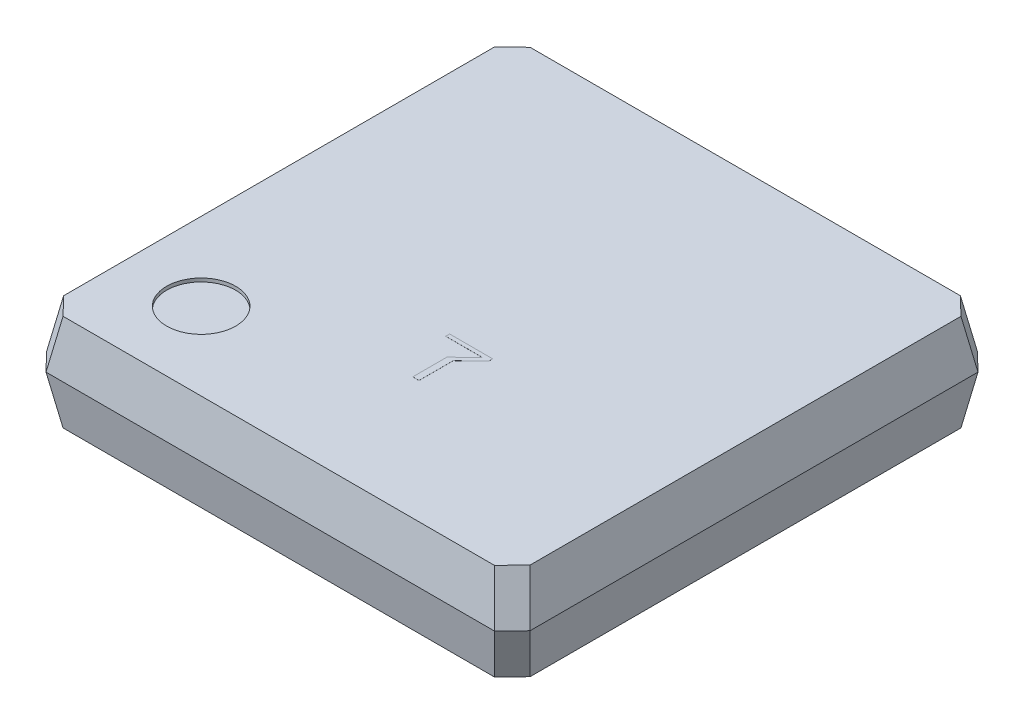
ISO-10303-21;
HEADER;
FILE_DESCRIPTION(('STEP AP214'),'2;1');
FILE_NAME('part.step','',(''),(''),'','','');
FILE_SCHEMA(('AUTOMOTIVE_DESIGN { 1 0 10303 214 1 1 1 1 }'));
ENDSEC;
DATA;
#1=APPLICATION_CONTEXT('core data for automotive mechanical design processes');
#2=APPLICATION_PROTOCOL_DEFINITION('international standard','automotive_design',2000,#1);
#3=PRODUCT_CONTEXT('',#1,'mechanical');
#4=PRODUCT('Part','Part','',(#3));
#5=PRODUCT_RELATED_PRODUCT_CATEGORY('part','',(#4));
#6=PRODUCT_DEFINITION_FORMATION('','',#4);
#7=PRODUCT_DEFINITION_CONTEXT('part definition',#1,'design');
#8=PRODUCT_DEFINITION('design','',#6,#7);
#9=PRODUCT_DEFINITION_SHAPE('','',#8);
#10=(LENGTH_UNIT() NAMED_UNIT(*) SI_UNIT(.MILLI.,.METRE.));
#11=(NAMED_UNIT(*) PLANE_ANGLE_UNIT() SI_UNIT($,.RADIAN.));
#12=(NAMED_UNIT(*) SI_UNIT($,.STERADIAN.) SOLID_ANGLE_UNIT());
#13=UNCERTAINTY_MEASURE_WITH_UNIT(LENGTH_MEASURE(1.E-05),#10,'distance_accuracy_value','');
#14=(GEOMETRIC_REPRESENTATION_CONTEXT(3) GLOBAL_UNCERTAINTY_ASSIGNED_CONTEXT((#13)) GLOBAL_UNIT_ASSIGNED_CONTEXT((#10,
#11,#12)) REPRESENTATION_CONTEXT('',''));
#15=CARTESIAN_POINT('',(0.,0.,0.));
#16=DIRECTION('',(0.,0.,1.));
#17=DIRECTION('',(1.,0.,0.));
#18=AXIS2_PLACEMENT_3D('',#15,#16,#17);
#19=CARTESIAN_POINT('',(3.90959752502728,1.401,-2.67054387635923));
#20=DIRECTION('',(0.,1.,0.));
#21=DIRECTION('',(0.,0.,1.));
#22=AXIS2_PLACEMENT_3D('',#19,#20,#21);
#23=PLANE('',#22);
#24=DIRECTION('',(-1.,0.,0.));
#25=VECTOR('',#24,1.);
#26=CARTESIAN_POINT('',(3.95907808146926,1.401,-2.38860021021396));
#27=LINE('',#26,#25);
#28=CARTESIAN_POINT('',(3.95664876640641,1.401,-2.38860021021396));
#29=VERTEX_POINT('',#28);
#30=CARTESIAN_POINT('',(3.95907808146926,1.401,-2.38860021021396));
#31=VERTEX_POINT('',#30);
#32=EDGE_CURVE('E217',#29,#31,#27,.F.);
#33=ORIENTED_EDGE('',*,*,#32,.F.);
#34=DIRECTION('',(0.721988222541395,0.,-0.691905345051993));
#35=VECTOR('',#34,1.);
#36=CARTESIAN_POINT('',(3.91086636434854,1.401,-2.34472541045385));
#37=LINE('',#36,#35);
#38=CARTESIAN_POINT('',(4.22125723786747,1.401,-2.64218331591268));
#39=VERTEX_POINT('',#38);
#40=EDGE_CURVE('E213',#39,#29,#37,.F.);
#41=ORIENTED_EDGE('',*,*,#40,.F.);
#42=DIRECTION('',(0.,0.,-1.));
#43=VECTOR('',#42,1.);
#44=CARTESIAN_POINT('',(4.22125723786747,1.401,-2.64218331591268));
#45=LINE('',#44,#43);
#46=CARTESIAN_POINT('',(4.22125723786747,1.401,-2.69890443680577));
#47=VERTEX_POINT('',#46);
#48=EDGE_CURVE('E209',#47,#39,#45,.F.);
#49=ORIENTED_EDGE('',*,*,#48,.F.);
#50=DIRECTION('',(-1.,0.,0.));
#51=VECTOR('',#50,1.);
#52=CARTESIAN_POINT('',(4.22125723786747,1.401,-2.69890443680577));
#53=LINE('',#52,#51);
#54=CARTESIAN_POINT('',(3.59793781218709,1.401,-2.69890443680577));
#55=VERTEX_POINT('',#54);
#56=EDGE_CURVE('E168',#55,#47,#53,.F.);
#57=ORIENTED_EDGE('',*,*,#56,.F.);
#58=DIRECTION('',(0.,0.,1.));
#59=VECTOR('',#58,1.);
#60=CARTESIAN_POINT('',(3.59793781218709,1.401,-2.69890443680577));
#61=LINE('',#60,#59);
#62=CARTESIAN_POINT('',(3.59793781218709,1.401,-2.64218331591268));
#63=VERTEX_POINT('',#62);
#64=EDGE_CURVE('E162',#63,#55,#61,.F.);
#65=ORIENTED_EDGE('',*,*,#64,.F.);
#66=DIRECTION('',(1.,0.,0.));
#67=VECTOR('',#66,1.);
#68=CARTESIAN_POINT('',(3.59793781218709,1.401,-2.64218331591268));
#69=LINE('',#68,#67);
#70=CARTESIAN_POINT('',(4.13342815482602,1.401,-2.64218331591268));
#71=VERTEX_POINT('',#70);
#72=EDGE_CURVE('E165',#71,#63,#69,.F.);
#73=ORIENTED_EDGE('',*,*,#72,.F.);
#74=DIRECTION('',(-0.721988222541394,0.,0.691905345051994));
#75=VECTOR('',#74,1.);
#76=CARTESIAN_POINT('',(4.17921055688388,1.401,-2.68605811567278));
#77=LINE('',#76,#75);
#78=CARTESIAN_POINT('',(3.86881968336495,1.401,-2.38860021021396));
#79=VERTEX_POINT('',#78);
#80=EDGE_CURVE('E229',#79,#71,#77,.F.);
#81=ORIENTED_EDGE('',*,*,#80,.F.);
#82=DIRECTION('',(0.,0.,1.));
#83=VECTOR('',#82,1.);
#84=CARTESIAN_POINT('',(3.86881968336495,1.401,-2.38860021021396));
#85=LINE('',#84,#83);
#86=CARTESIAN_POINT('',(3.86881968336495,1.401,-1.89432805503848));
#87=VERTEX_POINT('',#86);
#88=EDGE_CURVE('E228',#87,#79,#85,.F.);
#89=ORIENTED_EDGE('',*,*,#88,.F.);
#90=DIRECTION('',(1.,0.,0.));
#91=VECTOR('',#90,1.);
#92=CARTESIAN_POINT('',(3.86881968336495,1.401,-1.89432805503848));
#93=LINE('',#92,#91);
#94=CARTESIAN_POINT('',(3.95907808146926,1.401,-1.89432805503848));
#95=VERTEX_POINT('',#94);
#96=EDGE_CURVE('E225',#95,#87,#93,.F.);
#97=ORIENTED_EDGE('',*,*,#96,.F.);
#98=DIRECTION('',(0.,0.,-1.));
#99=VECTOR('',#98,1.);
#100=CARTESIAN_POINT('',(3.95907808146926,1.401,-1.89432805503848));
#101=LINE('',#100,#99);
#102=EDGE_CURVE('E221',#31,#95,#101,.F.);
#103=ORIENTED_EDGE('',*,*,#102,.F.);
#104=EDGE_LOOP('',(#33,#41,#49,#57,#65,#73,#81,#89,#97,#103));
#105=FACE_BOUND('',#104,.T.);
#106=ADVANCED_FACE('F16',(#105),#23,.T.);
#107=CARTESIAN_POINT('',(1.45,1.35,-1.25));
#108=DIRECTION('',(0.,1.,0.));
#109=DIRECTION('',(0.,0.,1.));
#110=AXIS2_PLACEMENT_3D('',#107,#108,#109);
#111=PLANE('',#110);
#112=CARTESIAN_POINT('',(1.45,1.35,-1.25));
#113=DIRECTION('',(0.,1.,0.));
#114=DIRECTION('',(0.,0.,1.));
#115=AXIS2_PLACEMENT_3D('',#112,#113,#114);
#116=CIRCLE('',#115,0.5);
#117=CARTESIAN_POINT('',(1.45,1.35,-0.75));
#118=VERTEX_POINT('',#117);
#119=EDGE_CURVE('E195',#118,#118,#116,.T.);
#120=ORIENTED_EDGE('',*,*,#119,.T.);
#121=EDGE_LOOP('',(#120));
#122=FACE_BOUND('',#121,.T.);
#123=ADVANCED_FACE('F539',(#122),#111,.T.);
#124=CARTESIAN_POINT('',(3.59793781218709,1.4,-2.69890443680577));
#125=DIRECTION('',(-1.,0.,0.));
#126=DIRECTION('',(0.,0.,1.));
#127=AXIS2_PLACEMENT_3D('',#124,#125,#126);
#128=PLANE('',#127);
#129=ORIENTED_EDGE('',*,*,#64,.T.);
#130=DIRECTION('',(0.,1.,0.));
#131=VECTOR('',#130,1.);
#132=CARTESIAN_POINT('',(3.59793781218709,1.4,-2.69890443680577));
#133=LINE('',#132,#131);
#134=CARTESIAN_POINT('',(3.59793781218709,1.4,-2.69890443680577));
#135=VERTEX_POINT('',#134);
#136=EDGE_CURVE('E204',#135,#55,#133,.T.);
#137=ORIENTED_EDGE('',*,*,#136,.F.);
#138=DIRECTION('',(0.,0.,-1.));
#139=VECTOR('',#138,1.);
#140=CARTESIAN_POINT('',(3.59793781218709,1.4,0.));
#141=LINE('',#140,#139);
#142=CARTESIAN_POINT('',(3.59793781218709,1.4,-2.64218331591268));
#143=VERTEX_POINT('',#142);
#144=EDGE_CURVE('E176',#135,#143,#141,.F.);
#145=ORIENTED_EDGE('',*,*,#144,.T.);
#146=DIRECTION('',(0.,1.,0.));
#147=VECTOR('',#146,1.);
#148=CARTESIAN_POINT('',(3.59793781218709,1.4,-2.64218331591268));
#149=LINE('',#148,#147);
#150=EDGE_CURVE('E19',#63,#143,#149,.F.);
#151=ORIENTED_EDGE('',*,*,#150,.F.);
#152=EDGE_LOOP('',(#129,#137,#145,#151));
#153=FACE_BOUND('',#152,.T.);
#154=ADVANCED_FACE('F174',(#153),#128,.T.);
#155=CARTESIAN_POINT('',(3.59793781218709,1.4,-2.64218331591268));
#156=DIRECTION('',(0.,0.,1.));
#157=DIRECTION('',(1.,0.,0.));
#158=AXIS2_PLACEMENT_3D('',#155,#156,#157);
#159=PLANE('',#158);
#160=ORIENTED_EDGE('',*,*,#150,.T.);
#161=DIRECTION('',(1.,0.,0.));
#162=VECTOR('',#161,1.);
#163=CARTESIAN_POINT('',(0.2,1.4,-2.64218331591268));
#164=LINE('',#163,#162);
#165=CARTESIAN_POINT('',(4.13342815482601,1.4,-2.64218331591268));
#166=VERTEX_POINT('',#165);
#167=EDGE_CURVE('E185',#143,#166,#164,.T.);
#168=ORIENTED_EDGE('',*,*,#167,.T.);
#169=DIRECTION('',(0.,1.,0.));
#170=VECTOR('',#169,1.);
#171=CARTESIAN_POINT('',(4.13342815482601,1.4,-2.64218331591268));
#172=LINE('',#171,#170);
#173=EDGE_CURVE('E179',#71,#166,#172,.F.);
#174=ORIENTED_EDGE('',*,*,#173,.F.);
#175=ORIENTED_EDGE('',*,*,#72,.T.);
#176=EDGE_LOOP('',(#160,#168,#174,#175));
#177=FACE_BOUND('',#176,.T.);
#178=ADVANCED_FACE('F180',(#177),#159,.T.);
#179=CARTESIAN_POINT('',(4.17921055688388,1.4,-2.68605811567278));
#180=DIRECTION('',(-0.691905345051994,0.,-0.721988222541394));
#181=DIRECTION('',(-0.721988222541394,0.,0.691905345051994));
#182=AXIS2_PLACEMENT_3D('',#179,#180,#181);
#183=PLANE('',#182);
#184=DIRECTION('',(0.,1.,0.));
#185=VECTOR('',#184,1.);
#186=CARTESIAN_POINT('',(3.86881968336495,1.4,-2.38860021021396));
#187=LINE('',#186,#185);
#188=CARTESIAN_POINT('',(3.86881968336495,1.4,-2.38860021021396));
#189=VERTEX_POINT('',#188);
#190=EDGE_CURVE('E226',#79,#189,#187,.F.);
#191=ORIENTED_EDGE('',*,*,#190,.F.);
#192=ORIENTED_EDGE('',*,*,#80,.T.);
#193=ORIENTED_EDGE('',*,*,#173,.T.);
#194=DIRECTION('',(-0.721988222541393,0.,0.691905345051995));
#195=VECTOR('',#194,1.);
#196=CARTESIAN_POINT('',(4.13342815482601,1.4,-2.64218331591268));
#197=LINE('',#196,#195);
#198=EDGE_CURVE('E236',#166,#189,#197,.T.);
#199=ORIENTED_EDGE('',*,*,#198,.T.);
#200=EDGE_LOOP('',(#191,#192,#193,#199));
#201=FACE_BOUND('',#200,.T.);
#202=ADVANCED_FACE('F561',(#201),#183,.T.);
#203=CARTESIAN_POINT('',(3.86881968336495,1.4,-2.38860021021396));
#204=DIRECTION('',(-1.,0.,0.));
#205=DIRECTION('',(0.,0.,1.));
#206=AXIS2_PLACEMENT_3D('',#203,#204,#205);
#207=PLANE('',#206);
#208=ORIENTED_EDGE('',*,*,#88,.T.);
#209=ORIENTED_EDGE('',*,*,#190,.T.);
#210=DIRECTION('',(0.,0.,-1.));
#211=VECTOR('',#210,1.);
#212=CARTESIAN_POINT('',(3.86881968336495,1.4,0.));
#213=LINE('',#212,#211);
#214=CARTESIAN_POINT('',(3.86881968336495,1.4,-1.89432805503848));
#215=VERTEX_POINT('',#214);
#216=EDGE_CURVE('E237',#189,#215,#213,.F.);
#217=ORIENTED_EDGE('',*,*,#216,.T.);
#218=DIRECTION('',(0.,1.,0.));
#219=VECTOR('',#218,1.);
#220=CARTESIAN_POINT('',(3.86881968336495,1.4,-1.89432805503848));
#221=LINE('',#220,#219);
#222=EDGE_CURVE('E222',#87,#215,#221,.F.);
#223=ORIENTED_EDGE('',*,*,#222,.F.);
#224=EDGE_LOOP('',(#208,#209,#217,#223));
#225=FACE_BOUND('',#224,.T.);
#226=ADVANCED_FACE('F568',(#225),#207,.T.);
#227=CARTESIAN_POINT('',(3.86881968336495,1.4,-1.89432805503848));
#228=DIRECTION('',(0.,0.,1.));
#229=DIRECTION('',(1.,0.,0.));
#230=AXIS2_PLACEMENT_3D('',#227,#228,#229);
#231=PLANE('',#230);
#232=ORIENTED_EDGE('',*,*,#96,.T.);
#233=ORIENTED_EDGE('',*,*,#222,.T.);
#234=DIRECTION('',(1.,0.,0.));
#235=VECTOR('',#234,1.);
#236=CARTESIAN_POINT('',(0.2,1.4,-1.89432805503848));
#237=LINE('',#236,#235);
#238=CARTESIAN_POINT('',(3.95907808146926,1.4,-1.89432805503848));
#239=VERTEX_POINT('',#238);
#240=EDGE_CURVE('E240',#215,#239,#237,.T.);
#241=ORIENTED_EDGE('',*,*,#240,.T.);
#242=DIRECTION('',(0.,1.,0.));
#243=VECTOR('',#242,1.);
#244=CARTESIAN_POINT('',(3.95907808146926,1.4,-1.89432805503848));
#245=LINE('',#244,#243);
#246=EDGE_CURVE('E218',#95,#239,#245,.F.);
#247=ORIENTED_EDGE('',*,*,#246,.F.);
#248=EDGE_LOOP('',(#232,#233,#241,#247));
#249=FACE_BOUND('',#248,.T.);
#250=ADVANCED_FACE('F575',(#249),#231,.T.);
#251=CARTESIAN_POINT('',(3.95907808146926,1.4,-1.89432805503848));
#252=DIRECTION('',(1.,0.,0.));
#253=DIRECTION('',(0.,0.,-1.));
#254=AXIS2_PLACEMENT_3D('',#251,#252,#253);
#255=PLANE('',#254);
#256=ORIENTED_EDGE('',*,*,#102,.T.);
#257=ORIENTED_EDGE('',*,*,#246,.T.);
#258=DIRECTION('',(0.,0.,-1.));
#259=VECTOR('',#258,1.);
#260=CARTESIAN_POINT('',(3.95907808146926,1.4,0.));
#261=LINE('',#260,#259);
#262=CARTESIAN_POINT('',(3.95907808146926,1.4,-2.38860021021396));
#263=VERTEX_POINT('',#262);
#264=EDGE_CURVE('E244',#239,#263,#261,.T.);
#265=ORIENTED_EDGE('',*,*,#264,.T.);
#266=DIRECTION('',(0.,1.,0.));
#267=VECTOR('',#266,1.);
#268=CARTESIAN_POINT('',(3.95907808146926,1.4,-2.38860021021396));
#269=LINE('',#268,#267);
#270=EDGE_CURVE('E214',#31,#263,#269,.F.);
#271=ORIENTED_EDGE('',*,*,#270,.F.);
#272=EDGE_LOOP('',(#256,#257,#265,#271));
#273=FACE_BOUND('',#272,.T.);
#274=ADVANCED_FACE('F583',(#273),#255,.T.);
#275=CARTESIAN_POINT('',(3.95907808146926,1.4,-2.38860021021396));
#276=DIRECTION('',(0.,0.,-1.));
#277=DIRECTION('',(-1.,0.,0.));
#278=AXIS2_PLACEMENT_3D('',#275,#276,#277);
#279=PLANE('',#278);
#280=ORIENTED_EDGE('',*,*,#270,.T.);
#281=DIRECTION('',(1.,0.,0.));
#282=VECTOR('',#281,1.);
#283=CARTESIAN_POINT('',(0.2,1.4,-2.38860021021396));
#284=LINE('',#283,#282);
#285=CARTESIAN_POINT('',(3.95664876640641,1.4,-2.38860021021396));
#286=VERTEX_POINT('',#285);
#287=EDGE_CURVE('E248',#263,#286,#284,.F.);
#288=ORIENTED_EDGE('',*,*,#287,.T.);
#289=DIRECTION('',(0.,1.,0.));
#290=VECTOR('',#289,1.);
#291=CARTESIAN_POINT('',(3.95664876640641,1.4,-2.38860021021396));
#292=LINE('',#291,#290);
#293=EDGE_CURVE('E210',#29,#286,#292,.F.);
#294=ORIENTED_EDGE('',*,*,#293,.F.);
#295=ORIENTED_EDGE('',*,*,#32,.T.);
#296=EDGE_LOOP('',(#280,#288,#294,#295));
#297=FACE_BOUND('',#296,.T.);
#298=ADVANCED_FACE('F591',(#297),#279,.T.);
#299=CARTESIAN_POINT('',(3.91086636434854,1.4,-2.34472541045385));
#300=DIRECTION('',(0.691905345051993,0.,0.721988222541395));
#301=DIRECTION('',(0.721988222541395,0.,-0.691905345051993));
#302=AXIS2_PLACEMENT_3D('',#299,#300,#301);
#303=PLANE('',#302);
#304=DIRECTION('',(0.,1.,0.));
#305=VECTOR('',#304,1.);
#306=CARTESIAN_POINT('',(4.22125723786747,1.4,-2.64218331591268));
#307=LINE('',#306,#305);
#308=CARTESIAN_POINT('',(4.22125723786747,1.4,-2.64218331591268));
#309=VERTEX_POINT('',#308);
#310=EDGE_CURVE('E206',#39,#309,#307,.F.);
#311=ORIENTED_EDGE('',*,*,#310,.F.);
#312=ORIENTED_EDGE('',*,*,#40,.T.);
#313=ORIENTED_EDGE('',*,*,#293,.T.);
#314=DIRECTION('',(0.721988222541394,0.,-0.691905345051993));
#315=VECTOR('',#314,1.);
#316=CARTESIAN_POINT('',(3.95664876640641,1.4,-2.38860021021396));
#317=LINE('',#316,#315);
#318=EDGE_CURVE('E252',#286,#309,#317,.T.);
#319=ORIENTED_EDGE('',*,*,#318,.T.);
#320=EDGE_LOOP('',(#311,#312,#313,#319));
#321=FACE_BOUND('',#320,.T.);
#322=ADVANCED_FACE('F599',(#321),#303,.T.);
#323=CARTESIAN_POINT('',(4.22125723786747,1.4,-2.64218331591268));
#324=DIRECTION('',(1.,0.,0.));
#325=DIRECTION('',(0.,0.,-1.));
#326=AXIS2_PLACEMENT_3D('',#323,#324,#325);
#327=PLANE('',#326);
#328=ORIENTED_EDGE('',*,*,#48,.T.);
#329=ORIENTED_EDGE('',*,*,#310,.T.);
#330=DIRECTION('',(0.,0.,-1.));
#331=VECTOR('',#330,1.);
#332=CARTESIAN_POINT('',(4.22125723786747,1.4,0.));
#333=LINE('',#332,#331);
#334=CARTESIAN_POINT('',(4.22125723786747,1.4,-2.69890443680577));
#335=VERTEX_POINT('',#334);
#336=EDGE_CURVE('E256',#309,#335,#333,.T.);
#337=ORIENTED_EDGE('',*,*,#336,.T.);
#338=DIRECTION('',(0.,1.,0.));
#339=VECTOR('',#338,1.);
#340=CARTESIAN_POINT('',(4.22125723786747,1.4,-2.69890443680577));
#341=LINE('',#340,#339);
#342=EDGE_CURVE('E199',#47,#335,#341,.F.);
#343=ORIENTED_EDGE('',*,*,#342,.F.);
#344=EDGE_LOOP('',(#328,#329,#337,#343));
#345=FACE_BOUND('',#344,.T.);
#346=ADVANCED_FACE('F607',(#345),#327,.T.);
#347=CARTESIAN_POINT('',(4.22125723786747,1.4,-2.69890443680577));
#348=DIRECTION('',(0.,0.,-1.));
#349=DIRECTION('',(-1.,0.,0.));
#350=AXIS2_PLACEMENT_3D('',#347,#348,#349);
#351=PLANE('',#350);
#352=ORIENTED_EDGE('',*,*,#56,.T.);
#353=ORIENTED_EDGE('',*,*,#342,.T.);
#354=DIRECTION('',(1.,0.,0.));
#355=VECTOR('',#354,1.);
#356=CARTESIAN_POINT('',(0.2,1.4,-2.69890443680577));
#357=LINE('',#356,#355);
#358=EDGE_CURVE('E192',#335,#135,#357,.F.);
#359=ORIENTED_EDGE('',*,*,#358,.T.);
#360=ORIENTED_EDGE('',*,*,#136,.T.);
#361=EDGE_LOOP('',(#352,#353,#359,#360));
#362=FACE_BOUND('',#361,.T.);
#363=ADVANCED_FACE('F615',(#362),#351,.T.);
#364=CARTESIAN_POINT('',(1.45,1.35,-1.25));
#365=DIRECTION('',(0.,1.,0.));
#366=DIRECTION('',(0.,0.,1.));
#367=AXIS2_PLACEMENT_3D('',#364,#365,#366);
#368=CYLINDRICAL_SURFACE('',#367,0.5);
#369=CARTESIAN_POINT('',(1.45,1.4,-1.25));
#370=DIRECTION('',(0.,1.,0.));
#371=DIRECTION('',(0.,0.,1.));
#372=AXIS2_PLACEMENT_3D('',#369,#370,#371);
#373=CIRCLE('',#372,0.5);
#374=CARTESIAN_POINT('',(1.45,1.4,-0.75));
#375=VERTEX_POINT('',#374);
#376=EDGE_CURVE('E188',#375,#375,#373,.T.);
#377=ORIENTED_EDGE('',*,*,#376,.T.);
#378=EDGE_LOOP('',(#377));
#379=FACE_BOUND('',#378,.T.);
#380=ORIENTED_EDGE('',*,*,#119,.F.);
#381=EDGE_LOOP('',(#380));
#382=FACE_BOUND('',#381,.T.);
#383=ADVANCED_FACE('F431',(#379,#382),#368,.F.);
#384=CARTESIAN_POINT('',(0.2,1.4,0.));
#385=DIRECTION('',(0.,-1.,0.));
#386=DIRECTION('',(0.,0.,-1.));
#387=AXIS2_PLACEMENT_3D('',#384,#385,#386);
#388=PLANE('',#387);
#389=ORIENTED_EDGE('',*,*,#376,.F.);
#390=EDGE_LOOP('',(#389));
#391=FACE_BOUND('',#390,.T.);
#392=ORIENTED_EDGE('',*,*,#336,.F.);
#393=ORIENTED_EDGE('',*,*,#318,.F.);
#394=ORIENTED_EDGE('',*,*,#287,.F.);
#395=ORIENTED_EDGE('',*,*,#264,.F.);
#396=ORIENTED_EDGE('',*,*,#240,.F.);
#397=ORIENTED_EDGE('',*,*,#216,.F.);
#398=ORIENTED_EDGE('',*,*,#198,.F.);
#399=ORIENTED_EDGE('',*,*,#167,.F.);
#400=ORIENTED_EDGE('',*,*,#144,.F.);
#401=ORIENTED_EDGE('',*,*,#358,.F.);
#402=EDGE_LOOP('',(#392,#393,#394,#395,#396,#397,#398,#399,#400,#401));
#403=FACE_BOUND('',#402,.T.);
#404=DIRECTION('',(0.71800996747602,0.,0.696032820063167));
#405=VECTOR('',#404,1.);
#406=CARTESIAN_POINT('',(6.81176271910074,1.4,-6.87953292476547));
#407=LINE('',#406,#405);
#408=CARTESIAN_POINT('',(7.07657111350407,1.4,-6.62282989572414));
#409=VERTEX_POINT('',#408);
#410=CARTESIAN_POINT('',(6.81481804917449,1.4,-6.87657111350407));
#411=VERTEX_POINT('',#410);
#412=EDGE_CURVE('E269',#409,#411,#407,.F.);
#413=ORIENTED_EDGE('',*,*,#412,.T.);
#414=DIRECTION('',(1.,0.,0.));
#415=VECTOR('',#414,1.);
#416=CARTESIAN_POINT('',(0.2,1.4,-6.87657111350407));
#417=LINE('',#416,#415);
#418=CARTESIAN_POINT('',(0.585181950825503,1.4,-6.87657111350407));
#419=VERTEX_POINT('',#418);
#420=EDGE_CURVE('E191',#411,#419,#417,.F.);
#421=ORIENTED_EDGE('',*,*,#420,.T.);
#422=DIRECTION('',(0.718009967476016,0.,-0.69603282006317));
#423=VECTOR('',#422,1.);
#424=CARTESIAN_POINT('',(0.323428886495926,1.4,-6.62282989572414));
#425=LINE('',#424,#423);
#426=CARTESIAN_POINT('',(0.323428886495925,1.4,-6.62282989572414));
#427=VERTEX_POINT('',#426);
#428=EDGE_CURVE('E198',#427,#419,#425,.T.);
#429=ORIENTED_EDGE('',*,*,#428,.F.);
#430=DIRECTION('',(0.,0.,1.));
#431=VECTOR('',#430,1.);
#432=CARTESIAN_POINT('',(0.323428886495926,1.4,0.));
#433=LINE('',#432,#431);
#434=CARTESIAN_POINT('',(0.323428886495926,1.4,-0.385181950825504));
#435=VERTEX_POINT('',#434);
#436=EDGE_CURVE('E293',#427,#435,#433,.T.);
#437=ORIENTED_EDGE('',*,*,#436,.T.);
#438=DIRECTION('',(-0.696032820063169,0.,-0.718009967476018));
#439=VECTOR('',#438,1.);
#440=CARTESIAN_POINT('',(0.323601353256336,1.4,-0.385004038449158));
#441=LINE('',#440,#439);
#442=CARTESIAN_POINT('',(0.577170104275856,1.4,-0.123428886495926));
#443=VERTEX_POINT('',#442);
#444=EDGE_CURVE('E288',#435,#443,#441,.F.);
#445=ORIENTED_EDGE('',*,*,#444,.T.);
#446=DIRECTION('',(1.,0.,0.));
#447=VECTOR('',#446,1.);
#448=CARTESIAN_POINT('',(0.2,1.4,-0.123428886495926));
#449=LINE('',#448,#447);
#450=CARTESIAN_POINT('',(6.82282989572415,1.4,-0.123428886495928));
#451=VERTEX_POINT('',#450);
#452=EDGE_CURVE('E283',#443,#451,#449,.T.);
#453=ORIENTED_EDGE('',*,*,#452,.T.);
#454=DIRECTION('',(-0.696032820063168,0.,0.718009967476019));
#455=VECTOR('',#454,1.);
#456=CARTESIAN_POINT('',(7.07639864674366,1.4,-0.385004038449158));
#457=LINE('',#456,#455);
#458=CARTESIAN_POINT('',(7.07657111350407,1.4,-0.385181950825505));
#459=VERTEX_POINT('',#458);
#460=EDGE_CURVE('E278',#451,#459,#457,.F.);
#461=ORIENTED_EDGE('',*,*,#460,.T.);
#462=DIRECTION('',(0.,0.,1.));
#463=VECTOR('',#462,1.);
#464=CARTESIAN_POINT('',(7.07657111350407,1.4,0.));
#465=LINE('',#464,#463);
#466=EDGE_CURVE('E272',#459,#409,#465,.F.);
#467=ORIENTED_EDGE('',*,*,#466,.T.);
#468=EDGE_LOOP('',(#413,#421,#429,#437,#445,#453,#461,#467));
#469=FACE_BOUND('',#468,.T.);
#470=ADVANCED_FACE('F391',(#391,#403,#469),#388,.F.);
#471=CARTESIAN_POINT('',(0.2,1.4,-6.87657111350407));
#472=DIRECTION('',(0.,-0.173648177666927,0.984807753012209));
#473=DIRECTION('',(0.,-0.984807753012209,-0.173648177666927));
#474=AXIS2_PLACEMENT_3D('',#471,#472,#473);
#475=PLANE('',#474);
#476=DIRECTION('',(0.171087869746025,-0.970287525247815,-0.171087869746038));
#477=VECTOR('',#476,1.);
#478=CARTESIAN_POINT('',(6.81481804917449,1.4,-6.87657111350408));
#479=LINE('',#478,#477);
#480=CARTESIAN_POINT('',(6.93824693567041,0.699999999999982,-7.));
#481=VERTEX_POINT('',#480);
#482=EDGE_CURVE('E267',#411,#481,#479,.T.);
#483=ORIENTED_EDGE('',*,*,#482,.T.);
#484=DIRECTION('',(1.,0.,0.));
#485=VECTOR('',#484,1.);
#486=CARTESIAN_POINT('',(0.2,0.699999999999982,-6.99999999999999));
#487=LINE('',#486,#485);
#488=CARTESIAN_POINT('',(0.461753064329584,0.699999999999982,-7.));
#489=VERTEX_POINT('',#488);
#490=EDGE_CURVE('E301',#489,#481,#487,.T.);
#491=ORIENTED_EDGE('',*,*,#490,.F.);
#492=DIRECTION('',(0.171087869746025,0.970287525247815,0.171087869746038));
#493=VECTOR('',#492,1.);
#494=CARTESIAN_POINT('',(0.461753064329578,0.699999999999983,-7.00000000000001));
#495=LINE('',#494,#493);
#496=EDGE_CURVE('E296',#489,#419,#495,.T.);
#497=ORIENTED_EDGE('',*,*,#496,.T.);
#498=ORIENTED_EDGE('',*,*,#420,.F.);
#499=EDGE_LOOP('',(#483,#491,#497,#498));
#500=FACE_BOUND('',#499,.T.);
#501=ADVANCED_FACE('F422',(#500),#475,.F.);
#502=CARTESIAN_POINT('',(6.62119531863031,2.4980890716,-6.68294838295989));
#503=DIRECTION('',(-0.675356736508174,-0.241927278412636,0.696681039223032));
#504=DIRECTION('',(0.71800996747602,0.,0.696032820063167));
#505=AXIS2_PLACEMENT_3D('',#502,#503,#504);
#506=PLANE('',#505);
#507=DIRECTION('',(0.171087869746032,-0.970287525247817,-0.171087869746024));
#508=VECTOR('',#507,1.);
#509=CARTESIAN_POINT('',(7.07657111350407,1.4,-6.62282989572414));
#510=LINE('',#509,#508);
#511=CARTESIAN_POINT('',(7.2,0.699999999999983,-6.74625878222006));
#512=VERTEX_POINT('',#511);
#513=EDGE_CURVE('E274',#409,#512,#510,.T.);
#514=ORIENTED_EDGE('',*,*,#513,.T.);
#515=DIRECTION('',(0.718009967476017,0.,0.69603282006317));
#516=VECTOR('',#515,1.);
#517=CARTESIAN_POINT('',(6.93513459480874,0.699999999999982,-7.00301707703941));
#518=LINE('',#517,#516);
#519=EDGE_CURVE('E304',#512,#481,#518,.F.);
#520=ORIENTED_EDGE('',*,*,#519,.T.);
#521=ORIENTED_EDGE('',*,*,#482,.F.);
#522=ORIENTED_EDGE('',*,*,#412,.F.);
#523=EDGE_LOOP('',(#514,#520,#521,#522));
#524=FACE_BOUND('',#523,.T.);
#525=ADVANCED_FACE('F420',(#524),#506,.F.);
#526=CARTESIAN_POINT('',(7.07657111350407,1.4,0.));
#527=DIRECTION('',(-0.984807753012209,-0.173648177666927,0.));
#528=DIRECTION('',(0.173648177666927,-0.984807753012209,0.));
#529=AXIS2_PLACEMENT_3D('',#526,#527,#528);
#530=PLANE('',#529);
#531=ORIENTED_EDGE('',*,*,#513,.F.);
#532=ORIENTED_EDGE('',*,*,#466,.F.);
#533=DIRECTION('',(0.171087869746035,-0.970287525247815,0.171087869746029));
#534=VECTOR('',#533,1.);
#535=CARTESIAN_POINT('',(7.07657111350407,1.4,-0.385181950825504));
#536=LINE('',#535,#534);
#537=CARTESIAN_POINT('',(7.2,0.699999999999981,-0.261753064329579));
#538=VERTEX_POINT('',#537);
#539=EDGE_CURVE('E276',#459,#538,#536,.T.);
#540=ORIENTED_EDGE('',*,*,#539,.T.);
#541=DIRECTION('',(0.,0.,1.));
#542=VECTOR('',#541,1.);
#543=CARTESIAN_POINT('',(7.19999999999999,0.699999999999982,0.));
#544=LINE('',#543,#542);
#545=EDGE_CURVE('E312',#512,#538,#544,.T.);
#546=ORIENTED_EDGE('',*,*,#545,.F.);
#547=EDGE_LOOP('',(#531,#532,#540,#546));
#548=FACE_BOUND('',#547,.T.);
#549=ADVANCED_FACE('F416',(#548),#530,.F.);
#550=CARTESIAN_POINT('',(7.08784579717953,1.33605809144942,-0.373907267150044));
#551=DIRECTION('',(-0.696681039223031,-0.241927278412636,-0.675356736508175));
#552=DIRECTION('',(-0.696032820063168,0.,0.718009967476019));
#553=AXIS2_PLACEMENT_3D('',#550,#551,#552);
#554=PLANE('',#553);
#555=DIRECTION('',(0.171087869746023,-0.970287525247817,0.171087869746033));
#556=VECTOR('',#555,1.);
#557=CARTESIAN_POINT('',(6.82282989572415,1.4,-0.123428886495926));
#558=LINE('',#557,#556);
#559=CARTESIAN_POINT('',(6.94625878222007,0.69999999999998,0.));
#560=VERTEX_POINT('',#559);
#561=EDGE_CURVE('E281',#451,#560,#558,.T.);
#562=ORIENTED_EDGE('',*,*,#561,.T.);
#563=DIRECTION('',(-0.696032820063171,0.,0.718009967476016));
#564=VECTOR('',#563,1.);
#565=CARTESIAN_POINT('',(7.19988279901761,0.699999999999982,-0.26163216274115));
#566=LINE('',#565,#564);
#567=EDGE_CURVE('E317',#560,#538,#566,.F.);
#568=ORIENTED_EDGE('',*,*,#567,.T.);
#569=ORIENTED_EDGE('',*,*,#539,.F.);
#570=ORIENTED_EDGE('',*,*,#460,.F.);
#571=EDGE_LOOP('',(#562,#568,#569,#570));
#572=FACE_BOUND('',#571,.T.);
#573=ADVANCED_FACE('F389',(#572),#554,.F.);
#574=CARTESIAN_POINT('',(0.2,1.4,-0.123428886495926));
#575=DIRECTION('',(0.,-0.173648177666927,-0.984807753012209));
#576=DIRECTION('',(0.,0.984807753012209,-0.173648177666927));
#577=AXIS2_PLACEMENT_3D('',#574,#575,#576);
#578=PLANE('',#577);
#579=DIRECTION('',(-0.171087869746032,-0.970287525247815,0.171087869746032));
#580=VECTOR('',#579,1.);
#581=CARTESIAN_POINT('',(0.577170104275856,1.4,-0.123428886495926));
#582=LINE('',#581,#580);
#583=CARTESIAN_POINT('',(0.453741217779931,0.69999999999998,0.));
#584=VERTEX_POINT('',#583);
#585=EDGE_CURVE('E286',#443,#584,#582,.T.);
#586=ORIENTED_EDGE('',*,*,#585,.T.);
#587=DIRECTION('',(1.,0.,0.));
#588=VECTOR('',#587,1.);
#589=CARTESIAN_POINT('',(0.2,0.699999999999981,0.));
#590=LINE('',#589,#588);
#591=EDGE_CURVE('E320',#560,#584,#590,.F.);
#592=ORIENTED_EDGE('',*,*,#591,.F.);
#593=ORIENTED_EDGE('',*,*,#561,.F.);
#594=ORIENTED_EDGE('',*,*,#452,.F.);
#595=EDGE_LOOP('',(#586,#592,#593,#594));
#596=FACE_BOUND('',#595,.T.);
#597=ADVANCED_FACE('F382',(#596),#578,.F.);
#598=CARTESIAN_POINT('',(0.312154202820466,1.33605809144942,-0.373907267150044));
#599=DIRECTION('',(0.69668103922303,-0.241927278412636,-0.675356736508176));
#600=DIRECTION('',(-0.696032820063169,0.,-0.718009967476018));
#601=AXIS2_PLACEMENT_3D('',#598,#599,#600);
#602=PLANE('',#601);
#603=DIRECTION('',(-0.171087869746032,-0.970287525247815,0.171087869746032));
#604=VECTOR('',#603,1.);
#605=CARTESIAN_POINT('',(0.323428886495926,1.4,-0.385181950825504));
#606=LINE('',#605,#604);
#607=CARTESIAN_POINT('',(0.200000000000002,0.69999999999998,-0.261753064329579));
#608=VERTEX_POINT('',#607);
#609=EDGE_CURVE('E291',#435,#608,#606,.T.);
#610=ORIENTED_EDGE('',*,*,#609,.T.);
#611=DIRECTION('',(-0.696032820063169,0.,-0.718009967476018));
#612=VECTOR('',#611,1.);
#613=CARTESIAN_POINT('',(0.200117200982388,0.699999999999982,-0.26163216274115));
#614=LINE('',#613,#612);
#615=EDGE_CURVE('E326',#608,#584,#614,.F.);
#616=ORIENTED_EDGE('',*,*,#615,.T.);
#617=ORIENTED_EDGE('',*,*,#585,.F.);
#618=ORIENTED_EDGE('',*,*,#444,.F.);
#619=EDGE_LOOP('',(#610,#616,#617,#618));
#620=FACE_BOUND('',#619,.T.);
#621=ADVANCED_FACE('F373',(#620),#602,.F.);
#622=CARTESIAN_POINT('',(0.323428886495926,1.4,0.));
#623=DIRECTION('',(0.984807753012209,-0.173648177666927,0.));
#624=DIRECTION('',(0.173648177666927,0.984807753012209,0.));
#625=AXIS2_PLACEMENT_3D('',#622,#623,#624);
#626=PLANE('',#625);
#627=DIRECTION('',(-0.171087869746034,-0.970287525247815,-0.171087869746029));
#628=VECTOR('',#627,1.);
#629=CARTESIAN_POINT('',(0.323428886495921,1.4,-6.62282989572415));
#630=LINE('',#629,#628);
#631=CARTESIAN_POINT('',(0.199999999999999,0.699999999999981,-6.74625878222006));
#632=VERTEX_POINT('',#631);
#633=EDGE_CURVE('E299',#427,#632,#630,.T.);
#634=ORIENTED_EDGE('',*,*,#633,.T.);
#635=DIRECTION('',(0.,0.,1.));
#636=VECTOR('',#635,1.);
#637=CARTESIAN_POINT('',(0.200000000000007,0.699999999999981,0.));
#638=LINE('',#637,#636);
#639=EDGE_CURVE('E331',#608,#632,#638,.F.);
#640=ORIENTED_EDGE('',*,*,#639,.F.);
#641=ORIENTED_EDGE('',*,*,#609,.F.);
#642=ORIENTED_EDGE('',*,*,#436,.F.);
#643=EDGE_LOOP('',(#634,#640,#641,#642));
#644=FACE_BOUND('',#643,.T.);
#645=ADVANCED_FACE('F395',(#644),#626,.F.);
#646=CARTESIAN_POINT('',(0.573907267150043,1.33605809144942,-6.88784579717954));
#647=DIRECTION('',(0.675356736508175,-0.241927278412636,0.696681039223031));
#648=DIRECTION('',(0.718009967476019,0.,-0.696032820063168));
#649=AXIS2_PLACEMENT_3D('',#646,#647,#648);
#650=PLANE('',#649);
#651=ORIENTED_EDGE('',*,*,#633,.F.);
#652=ORIENTED_EDGE('',*,*,#428,.T.);
#653=ORIENTED_EDGE('',*,*,#496,.F.);
#654=DIRECTION('',(0.718009967476016,0.,-0.696032820063171));
#655=VECTOR('',#654,1.);
#656=CARTESIAN_POINT('',(0.46163216274115,0.699999999999982,-6.99988279901762));
#657=LINE('',#656,#655);
#658=EDGE_CURVE('E339',#489,#632,#657,.F.);
#659=ORIENTED_EDGE('',*,*,#658,.T.);
#660=EDGE_LOOP('',(#651,#652,#653,#659));
#661=FACE_BOUND('',#660,.T.);
#662=ADVANCED_FACE('F399',(#661),#650,.F.);
#663=CARTESIAN_POINT('',(0.2,0.700000000000018,-7.));
#664=DIRECTION('',(0.,-0.173648177666927,-0.984807753012209));
#665=DIRECTION('',(0.,0.984807753012209,-0.173648177666927));
#666=AXIS2_PLACEMENT_3D('',#663,#664,#665);
#667=PLANE('',#666);
#668=DIRECTION('',(1.,0.,0.));
#669=VECTOR('',#668,1.);
#670=CARTESIAN_POINT('',(0.2,0.,-6.87657111350407));
#671=LINE('',#670,#669);
#672=CARTESIAN_POINT('',(0.585181950825503,0.,-6.87657111350407));
#673=VERTEX_POINT('',#672);
#674=CARTESIAN_POINT('',(6.8148180491745,0.,-6.87657111350407));
#675=VERTEX_POINT('',#674);
#676=EDGE_CURVE('E343',#673,#675,#671,.T.);
#677=ORIENTED_EDGE('',*,*,#676,.F.);
#678=DIRECTION('',(-0.171087869746026,0.970287525247815,-0.17108786974604));
#679=VECTOR('',#678,1.);
#680=CARTESIAN_POINT('',(0.585181950825502,0.,-6.87657111350407));
#681=LINE('',#680,#679);
#682=EDGE_CURVE('E336',#673,#489,#681,.T.);
#683=ORIENTED_EDGE('',*,*,#682,.T.);
#684=ORIENTED_EDGE('',*,*,#490,.T.);
#685=DIRECTION('',(-0.171087869746019,-0.970287525247815,0.171087869746045));
#686=VECTOR('',#685,1.);
#687=CARTESIAN_POINT('',(6.93824693567041,0.699999999999981,-7.));
#688=LINE('',#687,#686);
#689=EDGE_CURVE('E307',#481,#675,#688,.T.);
#690=ORIENTED_EDGE('',*,*,#689,.T.);
#691=EDGE_LOOP('',(#677,#683,#684,#690));
#692=FACE_BOUND('',#691,.T.);
#693=ADVANCED_FACE('F404',(#692),#667,.T.);
#694=CARTESIAN_POINT('',(6.7410113108858,-0.418578813021952,-6.80276437521538));
#695=DIRECTION('',(-0.675356736508177,0.241927278412637,0.696681039223029));
#696=DIRECTION('',(0.718009967476017,0.,0.69603282006317));
#697=AXIS2_PLACEMENT_3D('',#694,#695,#696);
#698=PLANE('',#697);
#699=ORIENTED_EDGE('',*,*,#689,.F.);
#700=ORIENTED_EDGE('',*,*,#519,.F.);
#701=DIRECTION('',(0.171087869746032,0.970287525247815,-0.171087869746032));
#702=VECTOR('',#701,1.);
#703=CARTESIAN_POINT('',(7.07657111350407,0.,-6.62282989572414));
#704=LINE('',#703,#702);
#705=CARTESIAN_POINT('',(7.07657111350407,0.,-6.62282989572414));
#706=VERTEX_POINT('',#705);
#707=EDGE_CURVE('E309',#706,#512,#704,.T.);
#708=ORIENTED_EDGE('',*,*,#707,.F.);
#709=DIRECTION('',(0.718009967476006,0.,0.696032820063181));
#710=VECTOR('',#709,1.);
#711=CARTESIAN_POINT('',(6.8148180491745,0.,-6.87657111350407));
#712=LINE('',#711,#710);
#713=EDGE_CURVE('E346',#675,#706,#712,.T.);
#714=ORIENTED_EDGE('',*,*,#713,.F.);
#715=EDGE_LOOP('',(#699,#700,#708,#714));
#716=FACE_BOUND('',#715,.T.);
#717=ADVANCED_FACE('F409',(#716),#698,.F.);
#718=CARTESIAN_POINT('',(7.2,0.700000000000018,0.));
#719=DIRECTION('',(0.984807753012209,-0.173648177666927,0.));
#720=DIRECTION('',(0.173648177666927,0.984807753012209,0.));
#721=AXIS2_PLACEMENT_3D('',#718,#719,#720);
#722=PLANE('',#721);
#723=ORIENTED_EDGE('',*,*,#545,.T.);
#724=DIRECTION('',(-0.171087869746036,-0.970287525247815,-0.17108786974603));
#725=VECTOR('',#724,1.);
#726=CARTESIAN_POINT('',(7.2,0.699999999999982,-0.261753064329583));
#727=LINE('',#726,#725);
#728=CARTESIAN_POINT('',(7.07657111350407,0.,-0.385181950825503));
#729=VERTEX_POINT('',#728);
#730=EDGE_CURVE('E315',#538,#729,#727,.T.);
#731=ORIENTED_EDGE('',*,*,#730,.T.);
#732=DIRECTION('',(0.,0.,-1.));
#733=VECTOR('',#732,1.);
#734=CARTESIAN_POINT('',(7.07657111350407,0.,0.));
#735=LINE('',#734,#733);
#736=EDGE_CURVE('E349',#706,#729,#735,.F.);
#737=ORIENTED_EDGE('',*,*,#736,.F.);
#738=ORIENTED_EDGE('',*,*,#707,.T.);
#739=EDGE_LOOP('',(#723,#731,#737,#738));
#740=FACE_BOUND('',#739,.T.);
#741=ADVANCED_FACE('F413',(#740),#722,.T.);
#742=CARTESIAN_POINT('',(7.20766178943503,0.743452167128635,-0.254091274894549));
#743=DIRECTION('',(-0.696681039223028,0.241927278412637,-0.675356736508178));
#744=DIRECTION('',(-0.696032820063171,0.,0.718009967476016));
#745=AXIS2_PLACEMENT_3D('',#742,#743,#744);
#746=PLANE('',#745);
#747=DIRECTION('',(0.171087869746047,0.970287525247812,0.171087869746032));
#748=VECTOR('',#747,1.);
#749=CARTESIAN_POINT('',(6.82282989572414,0.,-0.123428886495926));
#750=LINE('',#749,#748);
#751=CARTESIAN_POINT('',(6.82282989572414,0.,-0.123428886495925));
#752=VERTEX_POINT('',#751);
#753=EDGE_CURVE('E323',#752,#560,#750,.T.);
#754=ORIENTED_EDGE('',*,*,#753,.F.);
#755=DIRECTION('',(-0.69603282006317,0.,0.718009967476016));
#756=VECTOR('',#755,1.);
#757=CARTESIAN_POINT('',(7.07657111350407,0.,-0.385181950825504));
#758=LINE('',#757,#756);
#759=EDGE_CURVE('E352',#729,#752,#758,.T.);
#760=ORIENTED_EDGE('',*,*,#759,.F.);
#761=ORIENTED_EDGE('',*,*,#730,.F.);
#762=ORIENTED_EDGE('',*,*,#567,.F.);
#763=EDGE_LOOP('',(#754,#760,#761,#762));
#764=FACE_BOUND('',#763,.T.);
#765=ADVANCED_FACE('F385',(#764),#746,.F.);
#766=CARTESIAN_POINT('',(0.2,0.700000000000018,0.));
#767=DIRECTION('',(0.,-0.173648177666927,0.984807753012209));
#768=DIRECTION('',(0.,-0.984807753012209,-0.173648177666927));
#769=AXIS2_PLACEMENT_3D('',#766,#767,#768);
#770=PLANE('',#769);
#771=DIRECTION('',(1.,0.,0.));
#772=VECTOR('',#771,1.);
#773=CARTESIAN_POINT('',(0.2,0.,-0.123428886495926));
#774=LINE('',#773,#772);
#775=CARTESIAN_POINT('',(0.577170104275856,0.,-0.123428886495926));
#776=VERTEX_POINT('',#775);
#777=EDGE_CURVE('E355',#752,#776,#774,.F.);
#778=ORIENTED_EDGE('',*,*,#777,.F.);
#779=ORIENTED_EDGE('',*,*,#753,.T.);
#780=ORIENTED_EDGE('',*,*,#591,.T.);
#781=DIRECTION('',(0.171087869746032,-0.970287525247815,-0.171087869746033));
#782=VECTOR('',#781,1.);
#783=CARTESIAN_POINT('',(0.453741217779936,0.699999999999982,0.));
#784=LINE('',#783,#782);
#785=EDGE_CURVE('E329',#584,#776,#784,.T.);
#786=ORIENTED_EDGE('',*,*,#785,.T.);
#787=EDGE_LOOP('',(#778,#779,#780,#786));
#788=FACE_BOUND('',#787,.T.);
#789=ADVANCED_FACE('F378',(#788),#770,.T.);
#790=CARTESIAN_POINT('',(0.192338210564972,0.743452167128635,-0.254091274894549));
#791=DIRECTION('',(0.69668103922303,0.241927278412637,-0.675356736508176));
#792=DIRECTION('',(-0.696032820063169,0.,-0.718009967476018));
#793=AXIS2_PLACEMENT_3D('',#790,#791,#792);
#794=PLANE('',#793);
#795=ORIENTED_EDGE('',*,*,#785,.F.);
#796=ORIENTED_EDGE('',*,*,#615,.F.);
#797=DIRECTION('',(-0.171087869746032,0.970287525247814,0.171087869746041));
#798=VECTOR('',#797,1.);
#799=CARTESIAN_POINT('',(0.323428886495926,0.,-0.385181950825504));
#800=LINE('',#799,#798);
#801=CARTESIAN_POINT('',(0.323428886495926,0.,-0.385181950825504));
#802=VERTEX_POINT('',#801);
#803=EDGE_CURVE('E333',#802,#608,#800,.T.);
#804=ORIENTED_EDGE('',*,*,#803,.F.);
#805=DIRECTION('',(-0.69603282006317,0.,-0.718009967476017));
#806=VECTOR('',#805,1.);
#807=CARTESIAN_POINT('',(0.577170104275856,0.,-0.123428886495926));
#808=LINE('',#807,#806);
#809=EDGE_CURVE('E358',#776,#802,#808,.T.);
#810=ORIENTED_EDGE('',*,*,#809,.F.);
#811=EDGE_LOOP('',(#795,#796,#804,#810));
#812=FACE_BOUND('',#811,.T.);
#813=ADVANCED_FACE('F370',(#812),#794,.F.);
#814=CARTESIAN_POINT('',(0.2,0.700000000000018,0.));
#815=DIRECTION('',(-0.984807753012209,-0.173648177666927,0.));
#816=DIRECTION('',(0.173648177666927,-0.984807753012209,0.));
#817=AXIS2_PLACEMENT_3D('',#814,#815,#816);
#818=PLANE('',#817);
#819=DIRECTION('',(0.,0.,-1.));
#820=VECTOR('',#819,1.);
#821=CARTESIAN_POINT('',(0.323428886495926,0.,0.));
#822=LINE('',#821,#820);
#823=CARTESIAN_POINT('',(0.323428886495925,0.,-6.62282989572414));
#824=VERTEX_POINT('',#823);
#825=EDGE_CURVE('E25',#802,#824,#822,.T.);
#826=ORIENTED_EDGE('',*,*,#825,.F.);
#827=ORIENTED_EDGE('',*,*,#803,.T.);
#828=ORIENTED_EDGE('',*,*,#639,.T.);
#829=DIRECTION('',(0.171087869746034,-0.970287525247815,0.17108786974603));
#830=VECTOR('',#829,1.);
#831=CARTESIAN_POINT('',(0.200000000000003,0.699999999999981,-6.74625878222006));
#832=LINE('',#831,#830);
#833=EDGE_CURVE('E34',#632,#824,#832,.T.);
#834=ORIENTED_EDGE('',*,*,#833,.T.);
#835=EDGE_LOOP('',(#826,#827,#828,#834));
#836=FACE_BOUND('',#835,.T.);
#837=ADVANCED_FACE('F365',(#836),#818,.T.);
#838=CARTESIAN_POINT('',(0.454091274894549,0.743452167128635,-7.00766178943503));
#839=DIRECTION('',(0.675356736508178,0.241927278412637,0.696681039223028));
#840=DIRECTION('',(0.718009967476016,0.,-0.696032820063171));
#841=AXIS2_PLACEMENT_3D('',#838,#839,#840);
#842=PLANE('',#841);
#843=ORIENTED_EDGE('',*,*,#833,.F.);
#844=ORIENTED_EDGE('',*,*,#658,.F.);
#845=ORIENTED_EDGE('',*,*,#682,.F.);
#846=DIRECTION('',(0.718009967476016,0.,-0.69603282006317));
#847=VECTOR('',#846,1.);
#848=CARTESIAN_POINT('',(0.323428886495926,0.,-6.62282989572414));
#849=LINE('',#848,#847);
#850=EDGE_CURVE('E11',#824,#673,#849,.T.);
#851=ORIENTED_EDGE('',*,*,#850,.F.);
#852=EDGE_LOOP('',(#843,#844,#845,#851));
#853=FACE_BOUND('',#852,.T.);
#854=ADVANCED_FACE('F402',(#853),#842,.F.);
#855=CARTESIAN_POINT('',(0.2,0.,0.));
#856=DIRECTION('',(0.,-1.,0.));
#857=DIRECTION('',(0.,0.,-1.));
#858=AXIS2_PLACEMENT_3D('',#855,#856,#857);
#859=PLANE('',#858);
#860=ORIENTED_EDGE('',*,*,#825,.T.);
#861=ORIENTED_EDGE('',*,*,#850,.T.);
#862=ORIENTED_EDGE('',*,*,#676,.T.);
#863=ORIENTED_EDGE('',*,*,#713,.T.);
#864=ORIENTED_EDGE('',*,*,#736,.T.);
#865=ORIENTED_EDGE('',*,*,#759,.T.);
#866=ORIENTED_EDGE('',*,*,#777,.T.);
#867=ORIENTED_EDGE('',*,*,#809,.T.);
#868=EDGE_LOOP('',(#860,#861,#862,#863,#864,#865,#866,#867));
#869=FACE_BOUND('',#868,.T.);
#870=ADVANCED_FACE('F363',(#869),#859,.T.);
#871=CLOSED_SHELL('',(#106,#123,#154,#178,#202,#226,#250,#274,#298,#322,#346,#363,#383,#470,
#501,#525,#549,#573,#597,#621,#645,#662,#693,#717,#741,#765,#789,#813,#837,#854,#870));
#872=MANIFOLD_SOLID_BREP('B1',#871);
#873=ADVANCED_BREP_SHAPE_REPRESENTATION('',(#18,#872),#14);
#874=SHAPE_DEFINITION_REPRESENTATION(#9,#873);
ENDSEC;
END-ISO-10303-21;
